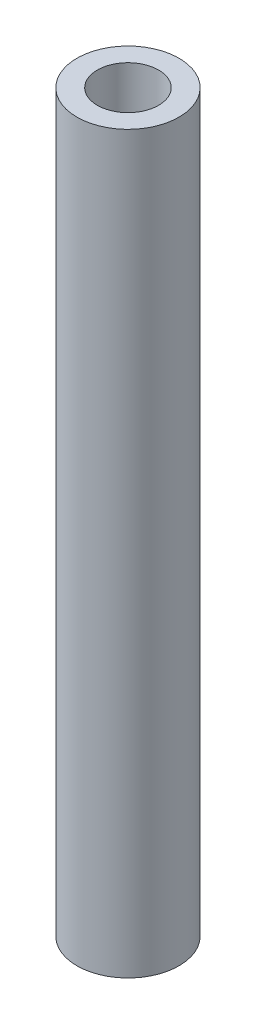
ISO-10303-21;
HEADER;
FILE_DESCRIPTION(('STEP AP214'),'2;1');
FILE_NAME('part.step','',(''),(''),'','','');
FILE_SCHEMA(('AUTOMOTIVE_DESIGN { 1 0 10303 214 1 1 1 1 }'));
ENDSEC;
DATA;
#1=APPLICATION_CONTEXT('core data for automotive mechanical design processes');
#2=APPLICATION_PROTOCOL_DEFINITION('international standard','automotive_design',2000,#1);
#3=PRODUCT_CONTEXT('',#1,'mechanical');
#4=PRODUCT('Part','Part','',(#3));
#5=PRODUCT_RELATED_PRODUCT_CATEGORY('part','',(#4));
#6=PRODUCT_DEFINITION_FORMATION('','',#4);
#7=PRODUCT_DEFINITION_CONTEXT('part definition',#1,'design');
#8=PRODUCT_DEFINITION('design','',#6,#7);
#9=PRODUCT_DEFINITION_SHAPE('','',#8);
#10=(LENGTH_UNIT() NAMED_UNIT(*) SI_UNIT(.MILLI.,.METRE.));
#11=(NAMED_UNIT(*) PLANE_ANGLE_UNIT() SI_UNIT($,.RADIAN.));
#12=(NAMED_UNIT(*) SI_UNIT($,.STERADIAN.) SOLID_ANGLE_UNIT());
#13=UNCERTAINTY_MEASURE_WITH_UNIT(LENGTH_MEASURE(1.E-05),#10,'distance_accuracy_value','');
#14=(GEOMETRIC_REPRESENTATION_CONTEXT(3) GLOBAL_UNCERTAINTY_ASSIGNED_CONTEXT((#13)) GLOBAL_UNIT_ASSIGNED_CONTEXT((#10,
#11,#12)) REPRESENTATION_CONTEXT('',''));
#15=CARTESIAN_POINT('',(0.,0.,0.));
#16=DIRECTION('',(0.,0.,1.));
#17=DIRECTION('',(1.,0.,0.));
#18=AXIS2_PLACEMENT_3D('',#15,#16,#17);
#19=CARTESIAN_POINT('',(0.,114.3,0.));
#20=DIRECTION('',(0.,1.,0.));
#21=DIRECTION('',(0.,0.,1.));
#22=AXIS2_PLACEMENT_3D('',#19,#20,#21);
#23=PLANE('',#22);
#24=CARTESIAN_POINT('',(0.,114.3,0.));
#25=DIRECTION('',(0.,1.,0.));
#26=DIRECTION('',(0.,0.,1.));
#27=AXIS2_PLACEMENT_3D('',#24,#25,#26);
#28=CIRCLE('',#27,7.9375);
#29=CARTESIAN_POINT('',(0.,114.3,7.9375));
#30=VERTEX_POINT('',#29);
#31=EDGE_CURVE('E10',#30,#30,#28,.T.);
#32=ORIENTED_EDGE('',*,*,#31,.T.);
#33=EDGE_LOOP('',(#32));
#34=FACE_BOUND('',#33,.T.);
#35=CARTESIAN_POINT('',(0.,114.3,0.));
#36=DIRECTION('',(0.,1.,0.));
#37=DIRECTION('',(0.,0.,1.));
#38=AXIS2_PLACEMENT_3D('',#35,#36,#37);
#39=CIRCLE('',#38,4.7625);
#40=CARTESIAN_POINT('',(0.,114.3,4.7625));
#41=VERTEX_POINT('',#40);
#42=EDGE_CURVE('E42',#41,#41,#39,.T.);
#43=ORIENTED_EDGE('',*,*,#42,.F.);
#44=EDGE_LOOP('',(#43));
#45=FACE_BOUND('',#44,.T.);
#46=ADVANCED_FACE('F31',(#34,#45),#23,.T.);
#47=CARTESIAN_POINT('',(0.,0.,0.));
#48=DIRECTION('',(0.,1.,0.));
#49=DIRECTION('',(0.,0.,1.));
#50=AXIS2_PLACEMENT_3D('',#47,#48,#49);
#51=PLANE('',#50);
#52=CARTESIAN_POINT('',(0.,0.,0.));
#53=DIRECTION('',(0.,1.,0.));
#54=DIRECTION('',(0.,0.,1.));
#55=AXIS2_PLACEMENT_3D('',#52,#53,#54);
#56=CIRCLE('',#55,7.9375);
#57=CARTESIAN_POINT('',(0.,0.,7.9375));
#58=VERTEX_POINT('',#57);
#59=EDGE_CURVE('E35',#58,#58,#56,.T.);
#60=ORIENTED_EDGE('',*,*,#59,.F.);
#61=EDGE_LOOP('',(#60));
#62=FACE_BOUND('',#61,.T.);
#63=CARTESIAN_POINT('',(0.,0.,0.));
#64=DIRECTION('',(0.,1.,0.));
#65=DIRECTION('',(0.,0.,1.));
#66=AXIS2_PLACEMENT_3D('',#63,#64,#65);
#67=CIRCLE('',#66,4.7625);
#68=CARTESIAN_POINT('',(0.,0.,4.7625));
#69=VERTEX_POINT('',#68);
#70=EDGE_CURVE('E44',#69,#69,#67,.T.);
#71=ORIENTED_EDGE('',*,*,#70,.T.);
#72=EDGE_LOOP('',(#71));
#73=FACE_BOUND('',#72,.T.);
#74=ADVANCED_FACE('F54',(#62,#73),#51,.F.);
#75=CARTESIAN_POINT('',(0.,114.3,0.));
#76=DIRECTION('',(0.,-1.,0.));
#77=DIRECTION('',(0.,0.,-1.));
#78=AXIS2_PLACEMENT_3D('',#75,#76,#77);
#79=CYLINDRICAL_SURFACE('',#78,7.9375);
#80=ORIENTED_EDGE('',*,*,#31,.F.);
#81=EDGE_LOOP('',(#80));
#82=FACE_BOUND('',#81,.T.);
#83=ORIENTED_EDGE('',*,*,#59,.T.);
#84=EDGE_LOOP('',(#83));
#85=FACE_BOUND('',#84,.T.);
#86=ADVANCED_FACE('F33',(#82,#85),#79,.T.);
#87=CARTESIAN_POINT('',(0.,114.3,0.));
#88=DIRECTION('',(0.,-1.,0.));
#89=DIRECTION('',(0.,0.,-1.));
#90=AXIS2_PLACEMENT_3D('',#87,#88,#89);
#91=CYLINDRICAL_SURFACE('',#90,4.7625);
#92=ORIENTED_EDGE('',*,*,#42,.T.);
#93=EDGE_LOOP('',(#92));
#94=FACE_BOUND('',#93,.T.);
#95=ORIENTED_EDGE('',*,*,#70,.F.);
#96=EDGE_LOOP('',(#95));
#97=FACE_BOUND('',#96,.T.);
#98=ADVANCED_FACE('F50',(#94,#97),#91,.F.);
#99=CLOSED_SHELL('',(#46,#74,#86,#98));
#100=MANIFOLD_SOLID_BREP('B2',#99);
#101=ADVANCED_BREP_SHAPE_REPRESENTATION('',(#18,#100),#14);
#102=SHAPE_DEFINITION_REPRESENTATION(#9,#101);
ENDSEC;
END-ISO-10303-21;
